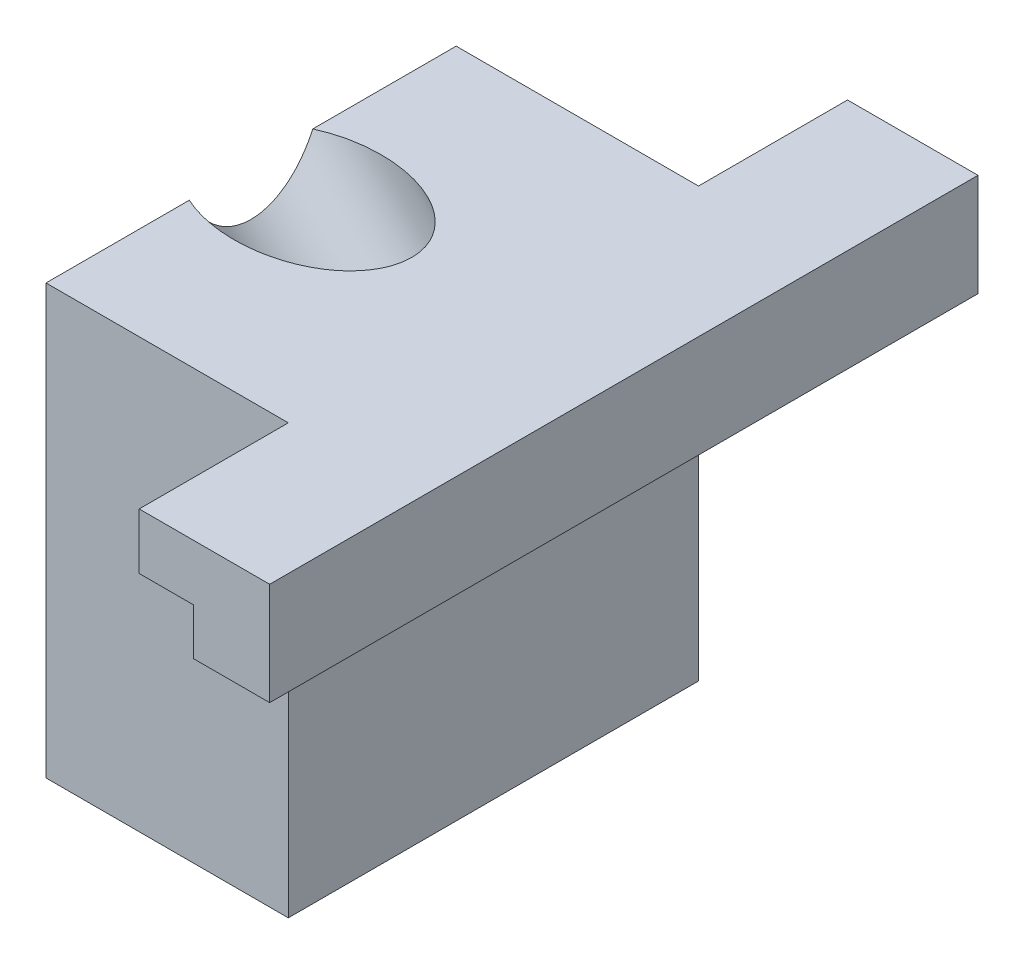
ISO-10303-21;
HEADER;
FILE_DESCRIPTION(('STEP AP214'),'2;1');
FILE_NAME('part.step','',(''),(''),'','','');
FILE_SCHEMA(('AUTOMOTIVE_DESIGN { 1 0 10303 214 1 1 1 1 }'));
ENDSEC;
DATA;
#1=APPLICATION_CONTEXT('core data for automotive mechanical design processes');
#2=APPLICATION_PROTOCOL_DEFINITION('international standard','automotive_design',2000,#1);
#3=PRODUCT_CONTEXT('',#1,'mechanical');
#4=PRODUCT('Part','Part','',(#3));
#5=PRODUCT_RELATED_PRODUCT_CATEGORY('part','',(#4));
#6=PRODUCT_DEFINITION_FORMATION('','',#4);
#7=PRODUCT_DEFINITION_CONTEXT('part definition',#1,'design');
#8=PRODUCT_DEFINITION('design','',#6,#7);
#9=PRODUCT_DEFINITION_SHAPE('','',#8);
#10=(LENGTH_UNIT() NAMED_UNIT(*) SI_UNIT(.MILLI.,.METRE.));
#11=(NAMED_UNIT(*) PLANE_ANGLE_UNIT() SI_UNIT($,.RADIAN.));
#12=(NAMED_UNIT(*) SI_UNIT($,.STERADIAN.) SOLID_ANGLE_UNIT());
#13=UNCERTAINTY_MEASURE_WITH_UNIT(LENGTH_MEASURE(1.E-05),#10,'distance_accuracy_value','');
#14=(GEOMETRIC_REPRESENTATION_CONTEXT(3) GLOBAL_UNCERTAINTY_ASSIGNED_CONTEXT((#13)) GLOBAL_UNIT_ASSIGNED_CONTEXT((#10,
#11,#12)) REPRESENTATION_CONTEXT('',''));
#15=CARTESIAN_POINT('',(0.,0.,0.));
#16=DIRECTION('',(0.,0.,1.));
#17=DIRECTION('',(1.,0.,0.));
#18=AXIS2_PLACEMENT_3D('',#15,#16,#17);
#19=CARTESIAN_POINT('',(0.,0.,0.));
#20=DIRECTION('',(1.,0.,0.));
#21=DIRECTION('',(0.,0.,-1.));
#22=AXIS2_PLACEMENT_3D('',#19,#20,#21);
#23=PLANE('',#22);
#24=CARTESIAN_POINT('',(0.,16.0394652582795,0.));
#25=DIRECTION('',(1.,0.,0.));
#26=DIRECTION('',(0.,-1.,0.));
#27=AXIS2_PLACEMENT_3D('',#24,#25,#26);
#28=ELLIPSE('',#27,5.58614357137374,3.95);
#29=CARTESIAN_POINT('',(0.,13.,-3.3141100572938));
#30=VERTEX_POINT('',#29);
#31=CARTESIAN_POINT('',(0.,13.,3.3141100572938));
#32=VERTEX_POINT('',#31);
#33=EDGE_CURVE('E48',#30,#32,#28,.F.);
#34=ORIENTED_EDGE('',*,*,#33,.F.);
#35=DIRECTION('',(0.,0.,1.));
#36=VECTOR('',#35,1.);
#37=CARTESIAN_POINT('',(0.,13.,11.));
#38=LINE('',#37,#36);
#39=CARTESIAN_POINT('',(0.,13.,-11.0045519758598));
#40=VERTEX_POINT('',#39);
#41=EDGE_CURVE('E137',#40,#30,#38,.T.);
#42=ORIENTED_EDGE('',*,*,#41,.F.);
#43=DIRECTION('',(0.,-1.,0.));
#44=VECTOR('',#43,1.);
#45=CARTESIAN_POINT('',(0.,13.,-11.0045519758598));
#46=LINE('',#45,#44);
#47=CARTESIAN_POINT('',(0.,10.,-11.0045519758598));
#48=VERTEX_POINT('',#47);
#49=EDGE_CURVE('E157',#40,#48,#46,.T.);
#50=ORIENTED_EDGE('',*,*,#49,.T.);
#51=DIRECTION('',(0.,0.,1.));
#52=VECTOR('',#51,1.);
#53=CARTESIAN_POINT('',(0.,10.,11.));
#54=LINE('',#53,#52);
#55=CARTESIAN_POINT('',(0.,10.,-11.));
#56=VERTEX_POINT('',#55);
#57=EDGE_CURVE('E158',#48,#56,#54,.T.);
#58=ORIENTED_EDGE('',*,*,#57,.T.);
#59=DIRECTION('',(0.,1.,0.));
#60=VECTOR('',#59,1.);
#61=CARTESIAN_POINT('',(0.,10.,-11.));
#62=LINE('',#61,#60);
#63=CARTESIAN_POINT('',(0.,-10.,-11.));
#64=VERTEX_POINT('',#63);
#65=EDGE_CURVE('E166',#64,#56,#62,.T.);
#66=ORIENTED_EDGE('',*,*,#65,.F.);
#67=DIRECTION('',(0.,0.,-1.));
#68=VECTOR('',#67,1.);
#69=CARTESIAN_POINT('',(0.,-10.,11.));
#70=LINE('',#69,#68);
#71=CARTESIAN_POINT('',(0.,-10.,11.));
#72=VERTEX_POINT('',#71);
#73=EDGE_CURVE('E170',#72,#64,#70,.T.);
#74=ORIENTED_EDGE('',*,*,#73,.F.);
#75=DIRECTION('',(0.,-1.,0.));
#76=VECTOR('',#75,1.);
#77=CARTESIAN_POINT('',(0.,10.,11.));
#78=LINE('',#77,#76);
#79=CARTESIAN_POINT('',(0.,13.,11.));
#80=VERTEX_POINT('',#79);
#81=EDGE_CURVE('E179',#80,#72,#78,.T.);
#82=ORIENTED_EDGE('',*,*,#81,.F.);
#83=EDGE_CURVE('E139',#32,#80,#38,.T.);
#84=ORIENTED_EDGE('',*,*,#83,.F.);
#85=EDGE_LOOP('',(#34,#42,#50,#58,#66,#74,#82,#84));
#86=FACE_BOUND('',#85,.T.);
#87=ADVANCED_FACE('F35',(#86),#23,.F.);
#88=CARTESIAN_POINT('',(0.,13.,0.));
#89=DIRECTION('',(0.,-1.,0.));
#90=DIRECTION('',(0.,0.,-1.));
#91=AXIS2_PLACEMENT_3D('',#88,#89,#90);
#92=PLANE('',#91);
#93=CARTESIAN_POINT('',(3.03946525827951,13.,0.));
#94=DIRECTION('',(0.,-1.,0.));
#95=DIRECTION('',(1.,0.,0.));
#96=AXIS2_PLACEMENT_3D('',#93,#94,#95);
#97=ELLIPSE('',#96,5.58614357137372,3.95);
#98=EDGE_CURVE('E11',#32,#30,#97,.F.);
#99=ORIENTED_EDGE('',*,*,#98,.F.);
#100=ORIENTED_EDGE('',*,*,#83,.T.);
#101=DIRECTION('',(1.,0.,0.));
#102=VECTOR('',#101,1.);
#103=CARTESIAN_POINT('',(0.,13.,11.));
#104=LINE('',#103,#102);
#105=CARTESIAN_POINT('',(13.,13.,11.));
#106=VERTEX_POINT('',#105);
#107=EDGE_CURVE('E148',#80,#106,#104,.T.);
#108=ORIENTED_EDGE('',*,*,#107,.T.);
#109=DIRECTION('',(0.,0.,-1.));
#110=VECTOR('',#109,1.);
#111=CARTESIAN_POINT('',(13.,13.,19.));
#112=LINE('',#111,#110);
#113=CARTESIAN_POINT('',(13.,13.,19.));
#114=VERTEX_POINT('',#113);
#115=EDGE_CURVE('E247',#114,#106,#112,.T.);
#116=ORIENTED_EDGE('',*,*,#115,.F.);
#117=DIRECTION('',(-1.,0.,0.));
#118=VECTOR('',#117,1.);
#119=CARTESIAN_POINT('',(20.,13.,19.));
#120=LINE('',#119,#118);
#121=CARTESIAN_POINT('',(20.,13.,19.));
#122=VERTEX_POINT('',#121);
#123=EDGE_CURVE('E234',#122,#114,#120,.T.);
#124=ORIENTED_EDGE('',*,*,#123,.F.);
#125=DIRECTION('',(0.,0.,1.));
#126=VECTOR('',#125,1.);
#127=CARTESIAN_POINT('',(20.,13.,11.));
#128=LINE('',#127,#126);
#129=CARTESIAN_POINT('',(20.,13.,-19.));
#130=VERTEX_POINT('',#129);
#131=EDGE_CURVE('E162',#130,#122,#128,.T.);
#132=ORIENTED_EDGE('',*,*,#131,.F.);
#133=DIRECTION('',(1.,0.,0.));
#134=VECTOR('',#133,1.);
#135=CARTESIAN_POINT('',(20.,13.,-19.));
#136=LINE('',#135,#134);
#137=CARTESIAN_POINT('',(13.,13.,-19.));
#138=VERTEX_POINT('',#137);
#139=EDGE_CURVE('E216',#138,#130,#136,.T.);
#140=ORIENTED_EDGE('',*,*,#139,.F.);
#141=DIRECTION('',(0.,0.,1.));
#142=VECTOR('',#141,1.);
#143=CARTESIAN_POINT('',(13.,13.,-19.));
#144=LINE('',#143,#142);
#145=CARTESIAN_POINT('',(13.,13.,-11.0045519758598));
#146=VERTEX_POINT('',#145);
#147=EDGE_CURVE('E208',#138,#146,#144,.T.);
#148=ORIENTED_EDGE('',*,*,#147,.T.);
#149=DIRECTION('',(-1.,0.,0.));
#150=VECTOR('',#149,1.);
#151=CARTESIAN_POINT('',(0.,13.,-11.0045519758598));
#152=LINE('',#151,#150);
#153=EDGE_CURVE('E146',#146,#40,#152,.T.);
#154=ORIENTED_EDGE('',*,*,#153,.T.);
#155=ORIENTED_EDGE('',*,*,#41,.T.);
#156=EDGE_LOOP('',(#99,#100,#108,#116,#124,#132,#140,#148,#154,#155));
#157=FACE_BOUND('',#156,.T.);
#158=ADVANCED_FACE('F143',(#157),#92,.F.);
#159=CARTESIAN_POINT('',(0.,13.,-11.0045519758598));
#160=DIRECTION('',(0.,0.,1.));
#161=DIRECTION('',(1.,0.,0.));
#162=AXIS2_PLACEMENT_3D('',#159,#160,#161);
#163=PLANE('',#162);
#164=DIRECTION('',(0.,1.,0.));
#165=VECTOR('',#164,1.);
#166=CARTESIAN_POINT('',(13.,13.,-11.0045519758598));
#167=LINE('',#166,#165);
#168=CARTESIAN_POINT('',(13.,10.,-11.0045519758598));
#169=VERTEX_POINT('',#168);
#170=EDGE_CURVE('E201',#169,#146,#167,.T.);
#171=ORIENTED_EDGE('',*,*,#170,.F.);
#172=DIRECTION('',(-1.,0.,0.));
#173=VECTOR('',#172,1.);
#174=CARTESIAN_POINT('',(0.,10.,-11.0045519758598));
#175=LINE('',#174,#173);
#176=EDGE_CURVE('E151',#169,#48,#175,.T.);
#177=ORIENTED_EDGE('',*,*,#176,.T.);
#178=ORIENTED_EDGE('',*,*,#49,.F.);
#179=ORIENTED_EDGE('',*,*,#153,.F.);
#180=EDGE_LOOP('',(#171,#177,#178,#179));
#181=FACE_BOUND('',#180,.T.);
#182=ADVANCED_FACE('F200',(#181),#163,.F.);
#183=CARTESIAN_POINT('',(13.,10.,11.));
#184=DIRECTION('',(0.,0.,-1.));
#185=DIRECTION('',(0.,1.,0.));
#186=AXIS2_PLACEMENT_3D('',#183,#184,#185);
#187=PLANE('',#186);
#188=DIRECTION('',(0.,-1.,0.));
#189=VECTOR('',#188,1.);
#190=CARTESIAN_POINT('',(13.,13.,11.));
#191=LINE('',#190,#189);
#192=CARTESIAN_POINT('',(13.,10.,11.));
#193=VERTEX_POINT('',#192);
#194=EDGE_CURVE('E56',#106,#193,#191,.T.);
#195=ORIENTED_EDGE('',*,*,#194,.F.);
#196=ORIENTED_EDGE('',*,*,#107,.F.);
#197=ORIENTED_EDGE('',*,*,#81,.T.);
#198=DIRECTION('',(-1.,0.,0.));
#199=VECTOR('',#198,1.);
#200=CARTESIAN_POINT('',(13.,-10.,11.));
#201=LINE('',#200,#199);
#202=CARTESIAN_POINT('',(13.,-10.,11.));
#203=VERTEX_POINT('',#202);
#204=EDGE_CURVE('E184',#203,#72,#201,.T.);
#205=ORIENTED_EDGE('',*,*,#204,.F.);
#206=DIRECTION('',(0.,-1.,0.));
#207=VECTOR('',#206,1.);
#208=CARTESIAN_POINT('',(13.,10.,11.));
#209=LINE('',#208,#207);
#210=EDGE_CURVE('E173',#193,#203,#209,.T.);
#211=ORIENTED_EDGE('',*,*,#210,.F.);
#212=EDGE_LOOP('',(#195,#196,#197,#205,#211));
#213=FACE_BOUND('',#212,.T.);
#214=ADVANCED_FACE('F312',(#213),#187,.F.);
#215=CARTESIAN_POINT('',(13.,10.,-11.));
#216=DIRECTION('',(0.,0.,1.));
#217=DIRECTION('',(1.,0.,0.));
#218=AXIS2_PLACEMENT_3D('',#215,#216,#217);
#219=PLANE('',#218);
#220=ORIENTED_EDGE('',*,*,#65,.T.);
#221=DIRECTION('',(-1.,0.,0.));
#222=VECTOR('',#221,1.);
#223=CARTESIAN_POINT('',(13.,10.,-11.));
#224=LINE('',#223,#222);
#225=CARTESIAN_POINT('',(13.,10.,-11.));
#226=VERTEX_POINT('',#225);
#227=EDGE_CURVE('E43',#226,#56,#224,.T.);
#228=ORIENTED_EDGE('',*,*,#227,.F.);
#229=DIRECTION('',(0.,1.,0.));
#230=VECTOR('',#229,1.);
#231=CARTESIAN_POINT('',(13.,10.,-11.));
#232=LINE('',#231,#230);
#233=CARTESIAN_POINT('',(13.,-10.,-11.));
#234=VERTEX_POINT('',#233);
#235=EDGE_CURVE('E167',#234,#226,#232,.T.);
#236=ORIENTED_EDGE('',*,*,#235,.F.);
#237=DIRECTION('',(-1.,0.,0.));
#238=VECTOR('',#237,1.);
#239=CARTESIAN_POINT('',(13.,-10.,-11.));
#240=LINE('',#239,#238);
#241=EDGE_CURVE('E177',#234,#64,#240,.T.);
#242=ORIENTED_EDGE('',*,*,#241,.T.);
#243=EDGE_LOOP('',(#220,#228,#236,#242));
#244=FACE_BOUND('',#243,.T.);
#245=ADVANCED_FACE('F37',(#244),#219,.F.);
#246=CARTESIAN_POINT('',(13.,-10.,11.));
#247=DIRECTION('',(0.,1.,0.));
#248=DIRECTION('',(0.,0.,1.));
#249=AXIS2_PLACEMENT_3D('',#246,#247,#248);
#250=PLANE('',#249);
#251=ORIENTED_EDGE('',*,*,#73,.T.);
#252=ORIENTED_EDGE('',*,*,#241,.F.);
#253=DIRECTION('',(0.,0.,-1.));
#254=VECTOR('',#253,1.);
#255=CARTESIAN_POINT('',(13.,-10.,11.));
#256=LINE('',#255,#254);
#257=EDGE_CURVE('E175',#203,#234,#256,.T.);
#258=ORIENTED_EDGE('',*,*,#257,.F.);
#259=ORIENTED_EDGE('',*,*,#204,.T.);
#260=EDGE_LOOP('',(#251,#252,#258,#259));
#261=FACE_BOUND('',#260,.T.);
#262=ADVANCED_FACE('F309',(#261),#250,.F.);
#263=CARTESIAN_POINT('',(13.,0.,0.));
#264=DIRECTION('',(1.,0.,0.));
#265=DIRECTION('',(0.,0.,-1.));
#266=AXIS2_PLACEMENT_3D('',#263,#264,#265);
#267=PLANE('',#266);
#268=CARTESIAN_POINT('',(13.,2.1,0.));
#269=DIRECTION('',(1.,0.,0.));
#270=DIRECTION('',(0.,0.,-1.));
#271=AXIS2_PLACEMENT_3D('',#268,#269,#270);
#272=CIRCLE('',#271,1.5);
#273=CARTESIAN_POINT('',(13.,2.1,-1.5));
#274=VERTEX_POINT('',#273);
#275=EDGE_CURVE('E140',#274,#274,#272,.T.);
#276=ORIENTED_EDGE('',*,*,#275,.F.);
#277=EDGE_LOOP('',(#276));
#278=FACE_BOUND('',#277,.T.);
#279=ORIENTED_EDGE('',*,*,#235,.T.);
#280=DIRECTION('',(0.,0.,1.));
#281=VECTOR('',#280,1.);
#282=CARTESIAN_POINT('',(13.,10.,11.));
#283=LINE('',#282,#281);
#284=EDGE_CURVE('E169',#226,#193,#283,.T.);
#285=ORIENTED_EDGE('',*,*,#284,.T.);
#286=ORIENTED_EDGE('',*,*,#210,.T.);
#287=ORIENTED_EDGE('',*,*,#257,.T.);
#288=EDGE_LOOP('',(#279,#285,#286,#287));
#289=FACE_BOUND('',#288,.T.);
#290=ADVANCED_FACE('F307',(#278,#289),#267,.T.);
#291=CARTESIAN_POINT('',(0.,10.,0.));
#292=DIRECTION('',(0.,-1.,0.));
#293=DIRECTION('',(0.,0.,-1.));
#294=AXIS2_PLACEMENT_3D('',#291,#292,#293);
#295=PLANE('',#294);
#296=ORIENTED_EDGE('',*,*,#284,.F.);
#297=ORIENTED_EDGE('',*,*,#227,.T.);
#298=ORIENTED_EDGE('',*,*,#57,.F.);
#299=ORIENTED_EDGE('',*,*,#176,.F.);
#300=DIRECTION('',(0.,0.,1.));
#301=VECTOR('',#300,1.);
#302=CARTESIAN_POINT('',(13.,10.,-19.));
#303=LINE('',#302,#301);
#304=CARTESIAN_POINT('',(13.,10.,-19.));
#305=VERTEX_POINT('',#304);
#306=EDGE_CURVE('E204',#305,#169,#303,.T.);
#307=ORIENTED_EDGE('',*,*,#306,.F.);
#308=DIRECTION('',(-1.,0.,0.));
#309=VECTOR('',#308,1.);
#310=CARTESIAN_POINT('',(13.,10.,-19.));
#311=LINE('',#310,#309);
#312=CARTESIAN_POINT('',(15.9,10.,-19.));
#313=VERTEX_POINT('',#312);
#314=EDGE_CURVE('E206',#313,#305,#311,.T.);
#315=ORIENTED_EDGE('',*,*,#314,.F.);
#316=DIRECTION('',(0.,0.,-1.));
#317=VECTOR('',#316,1.);
#318=CARTESIAN_POINT('',(15.9,10.,11.));
#319=LINE('',#318,#317);
#320=CARTESIAN_POINT('',(15.9,10.,19.));
#321=VERTEX_POINT('',#320);
#322=EDGE_CURVE('E161',#321,#313,#319,.T.);
#323=ORIENTED_EDGE('',*,*,#322,.F.);
#324=DIRECTION('',(1.,0.,0.));
#325=VECTOR('',#324,1.);
#326=CARTESIAN_POINT('',(13.,10.,19.));
#327=LINE('',#326,#325);
#328=CARTESIAN_POINT('',(13.,10.,19.));
#329=VERTEX_POINT('',#328);
#330=EDGE_CURVE('E238',#329,#321,#327,.T.);
#331=ORIENTED_EDGE('',*,*,#330,.F.);
#332=DIRECTION('',(0.,0.,-1.));
#333=VECTOR('',#332,1.);
#334=CARTESIAN_POINT('',(13.,10.,19.));
#335=LINE('',#334,#333);
#336=EDGE_CURVE('E244',#329,#193,#335,.T.);
#337=ORIENTED_EDGE('',*,*,#336,.T.);
#338=EDGE_LOOP('',(#296,#297,#298,#299,#307,#315,#323,#331,#337));
#339=FACE_BOUND('',#338,.T.);
#340=ADVANCED_FACE('F191',(#339),#295,.T.);
#341=CARTESIAN_POINT('',(15.9,0.,0.));
#342=DIRECTION('',(1.,0.,0.));
#343=DIRECTION('',(0.,0.,-1.));
#344=AXIS2_PLACEMENT_3D('',#341,#342,#343);
#345=PLANE('',#344);
#346=DIRECTION('',(0.,0.,-1.));
#347=VECTOR('',#346,1.);
#348=CARTESIAN_POINT('',(15.9,7.5,11.));
#349=LINE('',#348,#347);
#350=CARTESIAN_POINT('',(15.9,7.5,19.));
#351=VERTEX_POINT('',#350);
#352=CARTESIAN_POINT('',(15.9,7.5,-19.));
#353=VERTEX_POINT('',#352);
#354=EDGE_CURVE('E153',#351,#353,#349,.T.);
#355=ORIENTED_EDGE('',*,*,#354,.F.);
#356=DIRECTION('',(0.,-1.,0.));
#357=VECTOR('',#356,1.);
#358=CARTESIAN_POINT('',(15.9,10.,19.));
#359=LINE('',#358,#357);
#360=EDGE_CURVE('E241',#321,#351,#359,.T.);
#361=ORIENTED_EDGE('',*,*,#360,.F.);
#362=ORIENTED_EDGE('',*,*,#322,.T.);
#363=DIRECTION('',(0.,1.,0.));
#364=VECTOR('',#363,1.);
#365=CARTESIAN_POINT('',(15.9,10.,-19.));
#366=LINE('',#365,#364);
#367=EDGE_CURVE('E220',#353,#313,#366,.T.);
#368=ORIENTED_EDGE('',*,*,#367,.F.);
#369=EDGE_LOOP('',(#355,#361,#362,#368));
#370=FACE_BOUND('',#369,.T.);
#371=ADVANCED_FACE('F267',(#370),#345,.F.);
#372=CARTESIAN_POINT('',(20.,7.5,11.));
#373=DIRECTION('',(0.,1.,0.));
#374=DIRECTION('',(0.,0.,1.));
#375=AXIS2_PLACEMENT_3D('',#372,#373,#374);
#376=PLANE('',#375);
#377=ORIENTED_EDGE('',*,*,#354,.T.);
#378=DIRECTION('',(-1.,0.,0.));
#379=VECTOR('',#378,1.);
#380=CARTESIAN_POINT('',(15.9,7.5,-19.));
#381=LINE('',#380,#379);
#382=CARTESIAN_POINT('',(20.,7.5,-19.));
#383=VERTEX_POINT('',#382);
#384=EDGE_CURVE('E274',#383,#353,#381,.T.);
#385=ORIENTED_EDGE('',*,*,#384,.F.);
#386=DIRECTION('',(0.,0.,-1.));
#387=VECTOR('',#386,1.);
#388=CARTESIAN_POINT('',(20.,7.5,11.));
#389=LINE('',#388,#387);
#390=CARTESIAN_POINT('',(20.,7.5,19.));
#391=VERTEX_POINT('',#390);
#392=EDGE_CURVE('E250',#391,#383,#389,.T.);
#393=ORIENTED_EDGE('',*,*,#392,.F.);
#394=DIRECTION('',(1.,0.,0.));
#395=VECTOR('',#394,1.);
#396=CARTESIAN_POINT('',(15.9,7.5,19.));
#397=LINE('',#396,#395);
#398=EDGE_CURVE('E228',#351,#391,#397,.T.);
#399=ORIENTED_EDGE('',*,*,#398,.F.);
#400=EDGE_LOOP('',(#377,#385,#393,#399));
#401=FACE_BOUND('',#400,.T.);
#402=ADVANCED_FACE('F273',(#401),#376,.F.);
#403=CARTESIAN_POINT('',(20.,0.,0.));
#404=DIRECTION('',(1.,0.,0.));
#405=DIRECTION('',(0.,0.,-1.));
#406=AXIS2_PLACEMENT_3D('',#403,#404,#405);
#407=PLANE('',#406);
#408=ORIENTED_EDGE('',*,*,#131,.T.);
#409=DIRECTION('',(0.,1.,0.));
#410=VECTOR('',#409,1.);
#411=CARTESIAN_POINT('',(20.,7.5,19.));
#412=LINE('',#411,#410);
#413=EDGE_CURVE('E231',#391,#122,#412,.T.);
#414=ORIENTED_EDGE('',*,*,#413,.F.);
#415=ORIENTED_EDGE('',*,*,#392,.T.);
#416=DIRECTION('',(0.,-1.,0.));
#417=VECTOR('',#416,1.);
#418=CARTESIAN_POINT('',(20.,7.5,-19.));
#419=LINE('',#418,#417);
#420=EDGE_CURVE('E218',#130,#383,#419,.T.);
#421=ORIENTED_EDGE('',*,*,#420,.F.);
#422=EDGE_LOOP('',(#408,#414,#415,#421));
#423=FACE_BOUND('',#422,.T.);
#424=ADVANCED_FACE('F254',(#423),#407,.T.);
#425=CARTESIAN_POINT('',(13.,13.,19.));
#426=DIRECTION('',(1.,0.,0.));
#427=DIRECTION('',(0.,0.,-1.));
#428=AXIS2_PLACEMENT_3D('',#425,#426,#427);
#429=PLANE('',#428);
#430=ORIENTED_EDGE('',*,*,#194,.T.);
#431=ORIENTED_EDGE('',*,*,#336,.F.);
#432=DIRECTION('',(0.,-1.,0.));
#433=VECTOR('',#432,1.);
#434=CARTESIAN_POINT('',(13.,13.,19.));
#435=LINE('',#434,#433);
#436=EDGE_CURVE('E236',#114,#329,#435,.T.);
#437=ORIENTED_EDGE('',*,*,#436,.F.);
#438=ORIENTED_EDGE('',*,*,#115,.T.);
#439=EDGE_LOOP('',(#430,#431,#437,#438));
#440=FACE_BOUND('',#439,.T.);
#441=ADVANCED_FACE('F263',(#440),#429,.F.);
#442=CARTESIAN_POINT('',(0.,0.,19.));
#443=DIRECTION('',(0.,0.,1.));
#444=DIRECTION('',(1.,0.,0.));
#445=AXIS2_PLACEMENT_3D('',#442,#443,#444);
#446=PLANE('',#445);
#447=ORIENTED_EDGE('',*,*,#398,.T.);
#448=ORIENTED_EDGE('',*,*,#413,.T.);
#449=ORIENTED_EDGE('',*,*,#123,.T.);
#450=ORIENTED_EDGE('',*,*,#436,.T.);
#451=ORIENTED_EDGE('',*,*,#330,.T.);
#452=ORIENTED_EDGE('',*,*,#360,.T.);
#453=EDGE_LOOP('',(#447,#448,#449,#450,#451,#452));
#454=FACE_BOUND('',#453,.T.);
#455=ADVANCED_FACE('F257',(#454),#446,.T.);
#456=CARTESIAN_POINT('',(13.,13.,-19.));
#457=DIRECTION('',(1.,0.,0.));
#458=DIRECTION('',(0.,0.,-1.));
#459=AXIS2_PLACEMENT_3D('',#456,#457,#458);
#460=PLANE('',#459);
#461=ORIENTED_EDGE('',*,*,#306,.T.);
#462=ORIENTED_EDGE('',*,*,#170,.T.);
#463=ORIENTED_EDGE('',*,*,#147,.F.);
#464=DIRECTION('',(0.,1.,0.));
#465=VECTOR('',#464,1.);
#466=CARTESIAN_POINT('',(13.,13.,-19.));
#467=LINE('',#466,#465);
#468=EDGE_CURVE('E211',#305,#138,#467,.T.);
#469=ORIENTED_EDGE('',*,*,#468,.F.);
#470=EDGE_LOOP('',(#461,#462,#463,#469));
#471=FACE_BOUND('',#470,.T.);
#472=ADVANCED_FACE('F212',(#471),#460,.F.);
#473=CARTESIAN_POINT('',(0.,0.,-19.));
#474=DIRECTION('',(0.,0.,1.));
#475=DIRECTION('',(1.,0.,0.));
#476=AXIS2_PLACEMENT_3D('',#473,#474,#475);
#477=PLANE('',#476);
#478=ORIENTED_EDGE('',*,*,#384,.T.);
#479=ORIENTED_EDGE('',*,*,#367,.T.);
#480=ORIENTED_EDGE('',*,*,#314,.T.);
#481=ORIENTED_EDGE('',*,*,#468,.T.);
#482=ORIENTED_EDGE('',*,*,#139,.T.);
#483=ORIENTED_EDGE('',*,*,#420,.T.);
#484=EDGE_LOOP('',(#478,#479,#480,#481,#482,#483));
#485=FACE_BOUND('',#484,.T.);
#486=ADVANCED_FACE('F275',(#485),#477,.F.);
#487=CARTESIAN_POINT('',(8.,2.1,0.));
#488=DIRECTION('',(1.,0.,0.));
#489=DIRECTION('',(0.,0.,-1.));
#490=AXIS2_PLACEMENT_3D('',#487,#488,#489);
#491=CYLINDRICAL_SURFACE('',#490,1.5);
#492=CARTESIAN_POINT('',(8.,2.1,0.));
#493=DIRECTION('',(1.,0.,0.));
#494=DIRECTION('',(0.,0.,-1.));
#495=AXIS2_PLACEMENT_3D('',#492,#493,#494);
#496=CIRCLE('',#495,1.5);
#497=CARTESIAN_POINT('',(8.,2.1,-1.5));
#498=VERTEX_POINT('',#497);
#499=EDGE_CURVE('E276',#498,#498,#496,.T.);
#500=ORIENTED_EDGE('',*,*,#499,.F.);
#501=EDGE_LOOP('',(#500));
#502=FACE_BOUND('',#501,.T.);
#503=ORIENTED_EDGE('',*,*,#275,.T.);
#504=EDGE_LOOP('',(#503));
#505=FACE_BOUND('',#504,.T.);
#506=ADVANCED_FACE('F296',(#502,#505),#491,.F.);
#507=CARTESIAN_POINT('',(8.,2.1,0.));
#508=DIRECTION('',(1.,0.,0.));
#509=DIRECTION('',(0.,0.,-1.));
#510=AXIS2_PLACEMENT_3D('',#507,#508,#509);
#511=PLANE('',#510);
#512=ORIENTED_EDGE('',*,*,#499,.T.);
#513=EDGE_LOOP('',(#512));
#514=FACE_BOUND('',#513,.T.);
#515=ADVANCED_FACE('F289',(#514),#511,.T.);
#516=CARTESIAN_POINT('',(1.51973262913976,14.5197326291398,0.));
#517=DIRECTION('',(0.707106781186546,-0.707106781186549,0.));
#518=DIRECTION('',(0.707106781186549,0.707106781186546,0.));
#519=AXIS2_PLACEMENT_3D('',#516,#517,#518);
#520=CYLINDRICAL_SURFACE('',#519,3.95);
#521=CARTESIAN_POINT('',(9.38369365981867,6.65577159846082,0.));
#522=DIRECTION('',(-0.707106781186546,0.707106781186549,0.));
#523=DIRECTION('',(-0.707106781186549,-0.707106781186546,0.));
#524=AXIS2_PLACEMENT_3D('',#521,#522,#523);
#525=CIRCLE('',#524,3.95);
#526=CARTESIAN_POINT('',(6.5906218741318,3.86269981277396,0.));
#527=VERTEX_POINT('',#526);
#528=EDGE_CURVE('E141',#527,#527,#525,.T.);
#529=ORIENTED_EDGE('',*,*,#528,.F.);
#530=EDGE_LOOP('',(#529));
#531=FACE_BOUND('',#530,.T.);
#532=ORIENTED_EDGE('',*,*,#33,.T.);
#533=ORIENTED_EDGE('',*,*,#98,.T.);
#534=EDGE_LOOP('',(#532,#533));
#535=FACE_BOUND('',#534,.T.);
#536=ADVANCED_FACE('F130',(#531,#535),#520,.F.);
#537=CARTESIAN_POINT('',(9.38369365981867,6.65577159846082,0.));
#538=DIRECTION('',(-0.707106781186546,0.707106781186549,0.));
#539=DIRECTION('',(-0.707106781186549,-0.707106781186546,0.));
#540=AXIS2_PLACEMENT_3D('',#537,#538,#539);
#541=PLANE('',#540);
#542=ORIENTED_EDGE('',*,*,#528,.T.);
#543=EDGE_LOOP('',(#542));
#544=FACE_BOUND('',#543,.T.);
#545=ADVANCED_FACE('F286',(#544),#541,.T.);
#546=CLOSED_SHELL('',(#87,#158,#182,#214,#245,#262,#290,#340,#371,#402,#424,#441,#455,#472,#486,
#506,#515,#536,#545));
#547=MANIFOLD_SOLID_BREP('B2',#546);
#548=ADVANCED_BREP_SHAPE_REPRESENTATION('',(#18,#547),#14);
#549=SHAPE_DEFINITION_REPRESENTATION(#9,#548);
ENDSEC;
END-ISO-10303-21;
